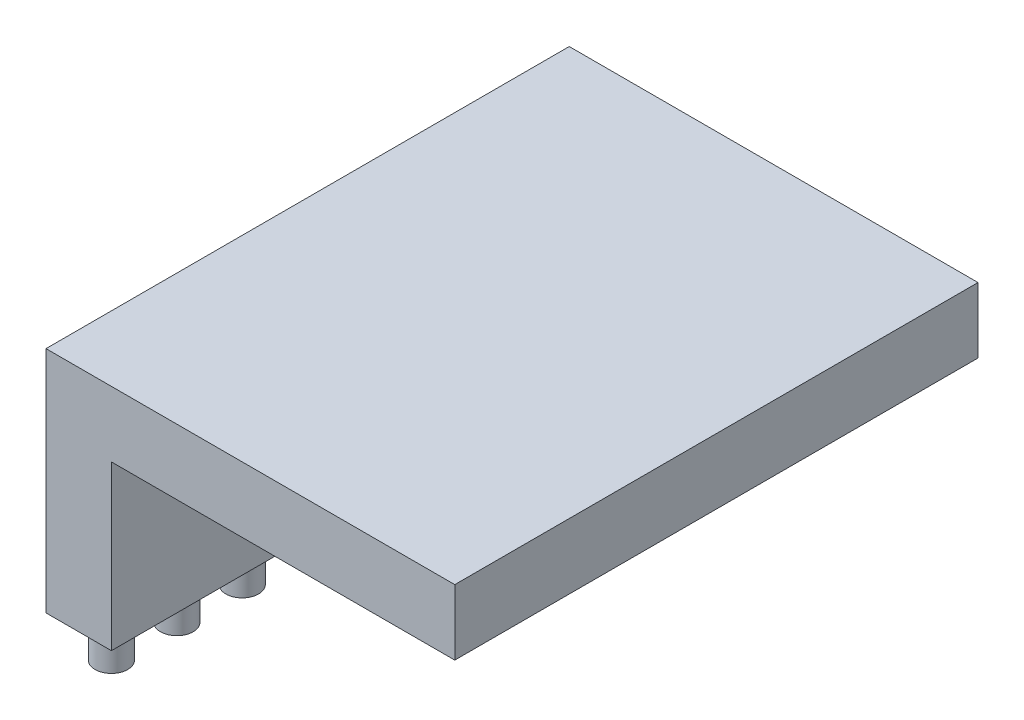
ISO-10303-21;
HEADER;
FILE_DESCRIPTION(('STEP AP214'),'2;1');
FILE_NAME('part.step','',(''),(''),'','','');
FILE_SCHEMA(('AUTOMOTIVE_DESIGN { 1 0 10303 214 1 1 1 1 }'));
ENDSEC;
DATA;
#1=APPLICATION_CONTEXT('core data for automotive mechanical design processes');
#2=APPLICATION_PROTOCOL_DEFINITION('international standard','automotive_design',2000,#1);
#3=PRODUCT_CONTEXT('',#1,'mechanical');
#4=PRODUCT('Part','Part','',(#3));
#5=PRODUCT_RELATED_PRODUCT_CATEGORY('part','',(#4));
#6=PRODUCT_DEFINITION_FORMATION('','',#4);
#7=PRODUCT_DEFINITION_CONTEXT('part definition',#1,'design');
#8=PRODUCT_DEFINITION('design','',#6,#7);
#9=PRODUCT_DEFINITION_SHAPE('','',#8);
#10=(LENGTH_UNIT() NAMED_UNIT(*) SI_UNIT(.MILLI.,.METRE.));
#11=(NAMED_UNIT(*) PLANE_ANGLE_UNIT() SI_UNIT($,.RADIAN.));
#12=(NAMED_UNIT(*) SI_UNIT($,.STERADIAN.) SOLID_ANGLE_UNIT());
#13=UNCERTAINTY_MEASURE_WITH_UNIT(LENGTH_MEASURE(1.E-05),#10,'distance_accuracy_value','');
#14=(GEOMETRIC_REPRESENTATION_CONTEXT(3) GLOBAL_UNCERTAINTY_ASSIGNED_CONTEXT((#13)) GLOBAL_UNIT_ASSIGNED_CONTEXT((#10,
#11,#12)) REPRESENTATION_CONTEXT('',''));
#15=CARTESIAN_POINT('',(0.,0.,0.));
#16=DIRECTION('',(0.,0.,1.));
#17=DIRECTION('',(1.,0.,0.));
#18=AXIS2_PLACEMENT_3D('',#15,#16,#17);
#19=CARTESIAN_POINT('',(0.,0.,0.));
#20=DIRECTION('',(0.,1.,0.));
#21=DIRECTION('',(0.,0.,1.));
#22=AXIS2_PLACEMENT_3D('',#19,#20,#21);
#23=PLANE('',#22);
#24=DIRECTION('',(0.,0.,1.));
#25=VECTOR('',#24,1.);
#26=CARTESIAN_POINT('',(-13.335,0.,0.));
#27=LINE('',#26,#25);
#28=CARTESIAN_POINT('',(-13.335,0.,-20.32));
#29=VERTEX_POINT('',#28);
#30=CARTESIAN_POINT('',(-13.335,0.,0.));
#31=VERTEX_POINT('',#30);
#32=EDGE_CURVE('E48',#29,#31,#27,.T.);
#33=ORIENTED_EDGE('',*,*,#32,.F.);
#34=DIRECTION('',(-1.,0.,0.));
#35=VECTOR('',#34,1.);
#36=CARTESIAN_POINT('',(0.,0.,-20.32));
#37=LINE('',#36,#35);
#38=CARTESIAN_POINT('',(0.,0.,-20.32));
#39=VERTEX_POINT('',#38);
#40=EDGE_CURVE('E135',#39,#29,#37,.T.);
#41=ORIENTED_EDGE('',*,*,#40,.F.);
#42=DIRECTION('',(0.,0.,-1.));
#43=VECTOR('',#42,1.);
#44=CARTESIAN_POINT('',(0.,0.,0.));
#45=LINE('',#44,#43);
#46=CARTESIAN_POINT('',(0.,0.,0.));
#47=VERTEX_POINT('',#46);
#48=EDGE_CURVE('E126',#47,#39,#45,.T.);
#49=ORIENTED_EDGE('',*,*,#48,.F.);
#50=DIRECTION('',(1.,0.,0.));
#51=VECTOR('',#50,1.);
#52=CARTESIAN_POINT('',(0.,0.,0.));
#53=LINE('',#52,#51);
#54=EDGE_CURVE('E70',#31,#47,#53,.T.);
#55=ORIENTED_EDGE('',*,*,#54,.F.);
#56=EDGE_LOOP('',(#33,#41,#49,#55));
#57=FACE_BOUND('',#56,.T.);
#58=ADVANCED_FACE('F33',(#57),#23,.F.);
#59=CARTESIAN_POINT('',(0.,2.54,0.));
#60=DIRECTION('',(-1.,0.,0.));
#61=DIRECTION('',(0.,0.,1.));
#62=AXIS2_PLACEMENT_3D('',#59,#60,#61);
#63=PLANE('',#62);
#64=ORIENTED_EDGE('',*,*,#48,.T.);
#65=DIRECTION('',(0.,-1.,0.));
#66=VECTOR('',#65,1.);
#67=CARTESIAN_POINT('',(0.,2.54,-20.32));
#68=LINE('',#67,#66);
#69=CARTESIAN_POINT('',(0.,2.54,-20.32));
#70=VERTEX_POINT('',#69);
#71=EDGE_CURVE('E11',#70,#39,#68,.T.);
#72=ORIENTED_EDGE('',*,*,#71,.F.);
#73=DIRECTION('',(0.,0.,-1.));
#74=VECTOR('',#73,1.);
#75=CARTESIAN_POINT('',(0.,2.54,0.));
#76=LINE('',#75,#74);
#77=CARTESIAN_POINT('',(0.,2.54,0.));
#78=VERTEX_POINT('',#77);
#79=EDGE_CURVE('E127',#78,#70,#76,.T.);
#80=ORIENTED_EDGE('',*,*,#79,.F.);
#81=DIRECTION('',(0.,-1.,0.));
#82=VECTOR('',#81,1.);
#83=CARTESIAN_POINT('',(0.,2.54,0.));
#84=LINE('',#83,#82);
#85=EDGE_CURVE('E132',#78,#47,#84,.T.);
#86=ORIENTED_EDGE('',*,*,#85,.T.);
#87=EDGE_LOOP('',(#64,#72,#80,#86));
#88=FACE_BOUND('',#87,.T.);
#89=ADVANCED_FACE('F35',(#88),#63,.F.);
#90=CARTESIAN_POINT('',(0.,2.54,-20.32));
#91=DIRECTION('',(0.,0.,1.));
#92=DIRECTION('',(1.,0.,0.));
#93=AXIS2_PLACEMENT_3D('',#90,#91,#92);
#94=PLANE('',#93);
#95=ORIENTED_EDGE('',*,*,#40,.T.);
#96=DIRECTION('',(0.,1.,0.));
#97=VECTOR('',#96,1.);
#98=CARTESIAN_POINT('',(-13.335,-6.35,-20.32));
#99=LINE('',#98,#97);
#100=CARTESIAN_POINT('',(-13.335,-6.35,-20.32));
#101=VERTEX_POINT('',#100);
#102=EDGE_CURVE('E105',#101,#29,#99,.T.);
#103=ORIENTED_EDGE('',*,*,#102,.F.);
#104=DIRECTION('',(1.,0.,0.));
#105=VECTOR('',#104,1.);
#106=CARTESIAN_POINT('',(-15.875,-6.35,-20.32));
#107=LINE('',#106,#105);
#108=CARTESIAN_POINT('',(-15.875,-6.35,-20.32));
#109=VERTEX_POINT('',#108);
#110=EDGE_CURVE('E102',#109,#101,#107,.T.);
#111=ORIENTED_EDGE('',*,*,#110,.F.);
#112=DIRECTION('',(0.,-1.,0.));
#113=VECTOR('',#112,1.);
#114=CARTESIAN_POINT('',(-15.875,2.54,-20.32));
#115=LINE('',#114,#113);
#116=CARTESIAN_POINT('',(-15.875,2.54,-20.32));
#117=VERTEX_POINT('',#116);
#118=EDGE_CURVE('E41',#117,#109,#115,.T.);
#119=ORIENTED_EDGE('',*,*,#118,.F.);
#120=DIRECTION('',(-1.,0.,0.));
#121=VECTOR('',#120,1.);
#122=CARTESIAN_POINT('',(0.,2.54,-20.32));
#123=LINE('',#122,#121);
#124=EDGE_CURVE('E77',#70,#117,#123,.T.);
#125=ORIENTED_EDGE('',*,*,#124,.F.);
#126=ORIENTED_EDGE('',*,*,#71,.T.);
#127=EDGE_LOOP('',(#95,#103,#111,#119,#125,#126));
#128=FACE_BOUND('',#127,.T.);
#129=ADVANCED_FACE('F103',(#128),#94,.F.);
#130=CARTESIAN_POINT('',(-15.875,2.54,0.));
#131=DIRECTION('',(1.,0.,0.));
#132=DIRECTION('',(0.,0.,-1.));
#133=AXIS2_PLACEMENT_3D('',#130,#131,#132);
#134=PLANE('',#133);
#135=ORIENTED_EDGE('',*,*,#118,.T.);
#136=DIRECTION('',(0.,0.,-1.));
#137=VECTOR('',#136,1.);
#138=CARTESIAN_POINT('',(-15.875,-6.35,0.));
#139=LINE('',#138,#137);
#140=CARTESIAN_POINT('',(-15.875,-6.35,0.));
#141=VERTEX_POINT('',#140);
#142=EDGE_CURVE('E98',#141,#109,#139,.T.);
#143=ORIENTED_EDGE('',*,*,#142,.F.);
#144=DIRECTION('',(0.,-1.,0.));
#145=VECTOR('',#144,1.);
#146=CARTESIAN_POINT('',(-15.875,2.54,0.));
#147=LINE('',#146,#145);
#148=CARTESIAN_POINT('',(-15.875,2.54,0.));
#149=VERTEX_POINT('',#148);
#150=EDGE_CURVE('E100',#149,#141,#147,.T.);
#151=ORIENTED_EDGE('',*,*,#150,.F.);
#152=DIRECTION('',(0.,0.,1.));
#153=VECTOR('',#152,1.);
#154=CARTESIAN_POINT('',(-15.875,2.54,0.));
#155=LINE('',#154,#153);
#156=EDGE_CURVE('E99',#117,#149,#155,.T.);
#157=ORIENTED_EDGE('',*,*,#156,.F.);
#158=EDGE_LOOP('',(#135,#143,#151,#157));
#159=FACE_BOUND('',#158,.T.);
#160=ADVANCED_FACE('F95',(#159),#134,.F.);
#161=CARTESIAN_POINT('',(0.,2.54,0.));
#162=DIRECTION('',(0.,0.,-1.));
#163=DIRECTION('',(-1.,0.,0.));
#164=AXIS2_PLACEMENT_3D('',#161,#162,#163);
#165=PLANE('',#164);
#166=ORIENTED_EDGE('',*,*,#150,.T.);
#167=DIRECTION('',(-1.,0.,0.));
#168=VECTOR('',#167,1.);
#169=CARTESIAN_POINT('',(-15.875,-6.35,0.));
#170=LINE('',#169,#168);
#171=CARTESIAN_POINT('',(-13.335,-6.35,0.));
#172=VERTEX_POINT('',#171);
#173=EDGE_CURVE('E113',#172,#141,#170,.T.);
#174=ORIENTED_EDGE('',*,*,#173,.F.);
#175=DIRECTION('',(0.,1.,0.));
#176=VECTOR('',#175,1.);
#177=CARTESIAN_POINT('',(-13.335,-6.35,0.));
#178=LINE('',#177,#176);
#179=EDGE_CURVE('E122',#172,#31,#178,.T.);
#180=ORIENTED_EDGE('',*,*,#179,.T.);
#181=ORIENTED_EDGE('',*,*,#54,.T.);
#182=ORIENTED_EDGE('',*,*,#85,.F.);
#183=DIRECTION('',(1.,0.,0.));
#184=VECTOR('',#183,1.);
#185=CARTESIAN_POINT('',(0.,2.54,0.));
#186=LINE('',#185,#184);
#187=EDGE_CURVE('E57',#149,#78,#186,.T.);
#188=ORIENTED_EDGE('',*,*,#187,.F.);
#189=EDGE_LOOP('',(#166,#174,#180,#181,#182,#188));
#190=FACE_BOUND('',#189,.T.);
#191=ADVANCED_FACE('F139',(#190),#165,.F.);
#192=CARTESIAN_POINT('',(0.,2.54,0.));
#193=DIRECTION('',(0.,1.,0.));
#194=DIRECTION('',(0.,0.,1.));
#195=AXIS2_PLACEMENT_3D('',#192,#193,#194);
#196=PLANE('',#195);
#197=ORIENTED_EDGE('',*,*,#79,.T.);
#198=ORIENTED_EDGE('',*,*,#124,.T.);
#199=ORIENTED_EDGE('',*,*,#156,.T.);
#200=ORIENTED_EDGE('',*,*,#187,.T.);
#201=EDGE_LOOP('',(#197,#198,#199,#200));
#202=FACE_BOUND('',#201,.T.);
#203=ADVANCED_FACE('F144',(#202),#196,.T.);
#204=CARTESIAN_POINT('',(-13.335,-6.35,0.));
#205=DIRECTION('',(-1.,0.,0.));
#206=DIRECTION('',(0.,0.,1.));
#207=AXIS2_PLACEMENT_3D('',#204,#205,#206);
#208=PLANE('',#207);
#209=ORIENTED_EDGE('',*,*,#32,.T.);
#210=ORIENTED_EDGE('',*,*,#179,.F.);
#211=DIRECTION('',(0.,0.,1.));
#212=VECTOR('',#211,1.);
#213=CARTESIAN_POINT('',(-13.335,-6.35,0.));
#214=LINE('',#213,#212);
#215=EDGE_CURVE('E108',#101,#172,#214,.T.);
#216=ORIENTED_EDGE('',*,*,#215,.F.);
#217=ORIENTED_EDGE('',*,*,#102,.T.);
#218=EDGE_LOOP('',(#209,#210,#216,#217));
#219=FACE_BOUND('',#218,.T.);
#220=ADVANCED_FACE('F146',(#219),#208,.F.);
#221=CARTESIAN_POINT('',(0.,-6.35,0.));
#222=DIRECTION('',(0.,-1.,0.));
#223=DIRECTION('',(0.,0.,-1.));
#224=AXIS2_PLACEMENT_3D('',#221,#222,#223);
#225=PLANE('',#224);
#226=CARTESIAN_POINT('',(-14.6049999999998,-6.35,-19.05));
#227=DIRECTION('',(0.,-1.,0.));
#228=DIRECTION('',(0.,0.,-1.));
#229=AXIS2_PLACEMENT_3D('',#226,#227,#228);
#230=CIRCLE('',#229,0.634999999999999);
#231=CARTESIAN_POINT('',(-14.6049999999998,-6.35,-19.685));
#232=VERTEX_POINT('',#231);
#233=EDGE_CURVE('E359',#232,#232,#230,.T.);
#234=ORIENTED_EDGE('',*,*,#233,.F.);
#235=EDGE_LOOP('',(#234));
#236=FACE_BOUND('',#235,.T.);
#237=CARTESIAN_POINT('',(-14.6049999999998,-6.35,-16.51));
#238=DIRECTION('',(0.,-1.,0.));
#239=DIRECTION('',(0.,0.,-1.));
#240=AXIS2_PLACEMENT_3D('',#237,#238,#239);
#241=CIRCLE('',#240,0.634999999999999);
#242=CARTESIAN_POINT('',(-14.6049999999998,-6.35,-17.145));
#243=VERTEX_POINT('',#242);
#244=EDGE_CURVE('E358',#243,#243,#241,.T.);
#245=ORIENTED_EDGE('',*,*,#244,.F.);
#246=EDGE_LOOP('',(#245));
#247=FACE_BOUND('',#246,.T.);
#248=CARTESIAN_POINT('',(-14.6049999999999,-6.35,-13.97));
#249=DIRECTION('',(0.,-1.,0.));
#250=DIRECTION('',(0.,0.,-1.));
#251=AXIS2_PLACEMENT_3D('',#248,#249,#250);
#252=CIRCLE('',#251,0.634999999999999);
#253=CARTESIAN_POINT('',(-14.6049999999999,-6.35,-14.605));
#254=VERTEX_POINT('',#253);
#255=EDGE_CURVE('E368',#254,#254,#252,.T.);
#256=ORIENTED_EDGE('',*,*,#255,.F.);
#257=EDGE_LOOP('',(#256));
#258=FACE_BOUND('',#257,.T.);
#259=CARTESIAN_POINT('',(-14.6049999999999,-6.35,-11.43));
#260=DIRECTION('',(0.,-1.,0.));
#261=DIRECTION('',(0.,0.,-1.));
#262=AXIS2_PLACEMENT_3D('',#259,#260,#261);
#263=CIRCLE('',#262,0.634999999999999);
#264=CARTESIAN_POINT('',(-14.6049999999999,-6.35,-12.065));
#265=VERTEX_POINT('',#264);
#266=EDGE_CURVE('E373',#265,#265,#263,.T.);
#267=ORIENTED_EDGE('',*,*,#266,.F.);
#268=EDGE_LOOP('',(#267));
#269=FACE_BOUND('',#268,.T.);
#270=CARTESIAN_POINT('',(-14.6049999999999,-6.35,-8.89));
#271=DIRECTION('',(0.,-1.,0.));
#272=DIRECTION('',(0.,0.,-1.));
#273=AXIS2_PLACEMENT_3D('',#270,#271,#272);
#274=CIRCLE('',#273,0.634999999999999);
#275=CARTESIAN_POINT('',(-14.6049999999999,-6.35,-9.525));
#276=VERTEX_POINT('',#275);
#277=EDGE_CURVE('E379',#276,#276,#274,.T.);
#278=ORIENTED_EDGE('',*,*,#277,.F.);
#279=EDGE_LOOP('',(#278));
#280=FACE_BOUND('',#279,.T.);
#281=CARTESIAN_POINT('',(-14.6049999999999,-6.35,-6.35));
#282=DIRECTION('',(0.,-1.,0.));
#283=DIRECTION('',(0.,0.,-1.));
#284=AXIS2_PLACEMENT_3D('',#281,#282,#283);
#285=CIRCLE('',#284,0.634999999999999);
#286=CARTESIAN_POINT('',(-14.6049999999999,-6.35,-6.985));
#287=VERTEX_POINT('',#286);
#288=EDGE_CURVE('E385',#287,#287,#285,.T.);
#289=ORIENTED_EDGE('',*,*,#288,.F.);
#290=EDGE_LOOP('',(#289));
#291=FACE_BOUND('',#290,.T.);
#292=CARTESIAN_POINT('',(-14.605,-6.35,-3.81));
#293=DIRECTION('',(0.,-1.,0.));
#294=DIRECTION('',(0.,0.,-1.));
#295=AXIS2_PLACEMENT_3D('',#292,#293,#294);
#296=CIRCLE('',#295,0.634999999999999);
#297=CARTESIAN_POINT('',(-14.605,-6.35,-4.445));
#298=VERTEX_POINT('',#297);
#299=EDGE_CURVE('E391',#298,#298,#296,.T.);
#300=ORIENTED_EDGE('',*,*,#299,.F.);
#301=EDGE_LOOP('',(#300));
#302=FACE_BOUND('',#301,.T.);
#303=CARTESIAN_POINT('',(-14.605,-6.35,-1.27));
#304=DIRECTION('',(0.,-1.,0.));
#305=DIRECTION('',(0.,0.,-1.));
#306=AXIS2_PLACEMENT_3D('',#303,#304,#305);
#307=CIRCLE('',#306,0.634999999999999);
#308=CARTESIAN_POINT('',(-14.605,-6.35,-1.905));
#309=VERTEX_POINT('',#308);
#310=EDGE_CURVE('E118',#309,#309,#307,.T.);
#311=ORIENTED_EDGE('',*,*,#310,.F.);
#312=EDGE_LOOP('',(#311));
#313=FACE_BOUND('',#312,.T.);
#314=ORIENTED_EDGE('',*,*,#142,.T.);
#315=ORIENTED_EDGE('',*,*,#110,.T.);
#316=ORIENTED_EDGE('',*,*,#215,.T.);
#317=ORIENTED_EDGE('',*,*,#173,.T.);
#318=EDGE_LOOP('',(#314,#315,#316,#317));
#319=FACE_BOUND('',#318,.T.);
#320=ADVANCED_FACE('F111',(#236,#247,#258,#269,#280,#291,#302,#313,#319),#225,.T.);
#321=CARTESIAN_POINT('',(-14.605,-7.9375,-1.27));
#322=DIRECTION('',(0.,1.,0.));
#323=DIRECTION('',(0.,0.,1.));
#324=AXIS2_PLACEMENT_3D('',#321,#322,#323);
#325=CYLINDRICAL_SURFACE('',#324,0.634999999999999);
#326=CARTESIAN_POINT('',(-14.605,-7.9375,-1.27));
#327=DIRECTION('',(0.,-1.,0.));
#328=DIRECTION('',(0.,0.,-1.));
#329=AXIS2_PLACEMENT_3D('',#326,#327,#328);
#330=CIRCLE('',#329,0.634999999999999);
#331=CARTESIAN_POINT('',(-14.605,-7.9375,-1.905));
#332=VERTEX_POINT('',#331);
#333=EDGE_CURVE('E115',#332,#332,#330,.T.);
#334=ORIENTED_EDGE('',*,*,#333,.F.);
#335=EDGE_LOOP('',(#334));
#336=FACE_BOUND('',#335,.T.);
#337=ORIENTED_EDGE('',*,*,#310,.T.);
#338=EDGE_LOOP('',(#337));
#339=FACE_BOUND('',#338,.T.);
#340=ADVANCED_FACE('F191',(#336,#339),#325,.T.);
#341=CARTESIAN_POINT('',(-14.605,-7.9375,-1.27));
#342=DIRECTION('',(0.,-1.,0.));
#343=DIRECTION('',(0.,0.,-1.));
#344=AXIS2_PLACEMENT_3D('',#341,#342,#343);
#345=PLANE('',#344);
#346=ORIENTED_EDGE('',*,*,#333,.T.);
#347=EDGE_LOOP('',(#346));
#348=FACE_BOUND('',#347,.T.);
#349=ADVANCED_FACE('F201',(#348),#345,.T.);
#350=CARTESIAN_POINT('',(-14.605,-7.9375,-3.81));
#351=DIRECTION('',(0.,1.,0.));
#352=DIRECTION('',(0.,0.,1.));
#353=AXIS2_PLACEMENT_3D('',#350,#351,#352);
#354=CYLINDRICAL_SURFACE('',#353,0.634999999999999);
#355=CARTESIAN_POINT('',(-14.605,-7.9375,-3.81));
#356=DIRECTION('',(0.,-1.,0.));
#357=DIRECTION('',(0.,0.,-1.));
#358=AXIS2_PLACEMENT_3D('',#355,#356,#357);
#359=CIRCLE('',#358,0.634999999999999);
#360=CARTESIAN_POINT('',(-14.605,-7.9375,-4.445));
#361=VERTEX_POINT('',#360);
#362=EDGE_CURVE('E394',#361,#361,#359,.T.);
#363=ORIENTED_EDGE('',*,*,#362,.F.);
#364=EDGE_LOOP('',(#363));
#365=FACE_BOUND('',#364,.T.);
#366=ORIENTED_EDGE('',*,*,#299,.T.);
#367=EDGE_LOOP('',(#366));
#368=FACE_BOUND('',#367,.T.);
#369=ADVANCED_FACE('F211',(#365,#368),#354,.T.);
#370=CARTESIAN_POINT('',(-14.605,-7.9375,-3.81));
#371=DIRECTION('',(0.,-1.,0.));
#372=DIRECTION('',(0.,0.,-1.));
#373=AXIS2_PLACEMENT_3D('',#370,#371,#372);
#374=PLANE('',#373);
#375=ORIENTED_EDGE('',*,*,#362,.T.);
#376=EDGE_LOOP('',(#375));
#377=FACE_BOUND('',#376,.T.);
#378=ADVANCED_FACE('F221',(#377),#374,.T.);
#379=CARTESIAN_POINT('',(-14.6049999999999,-7.9375,-6.35));
#380=DIRECTION('',(0.,1.,0.));
#381=DIRECTION('',(0.,0.,1.));
#382=AXIS2_PLACEMENT_3D('',#379,#380,#381);
#383=CYLINDRICAL_SURFACE('',#382,0.634999999999999);
#384=CARTESIAN_POINT('',(-14.6049999999999,-7.9375,-6.35));
#385=DIRECTION('',(0.,-1.,0.));
#386=DIRECTION('',(0.,0.,-1.));
#387=AXIS2_PLACEMENT_3D('',#384,#385,#386);
#388=CIRCLE('',#387,0.634999999999999);
#389=CARTESIAN_POINT('',(-14.6049999999999,-7.9375,-6.985));
#390=VERTEX_POINT('',#389);
#391=EDGE_CURVE('E388',#390,#390,#388,.T.);
#392=ORIENTED_EDGE('',*,*,#391,.F.);
#393=EDGE_LOOP('',(#392));
#394=FACE_BOUND('',#393,.T.);
#395=ORIENTED_EDGE('',*,*,#288,.T.);
#396=EDGE_LOOP('',(#395));
#397=FACE_BOUND('',#396,.T.);
#398=ADVANCED_FACE('F231',(#394,#397),#383,.T.);
#399=CARTESIAN_POINT('',(-14.6049999999999,-7.9375,-6.35));
#400=DIRECTION('',(0.,-1.,0.));
#401=DIRECTION('',(0.,0.,-1.));
#402=AXIS2_PLACEMENT_3D('',#399,#400,#401);
#403=PLANE('',#402);
#404=ORIENTED_EDGE('',*,*,#391,.T.);
#405=EDGE_LOOP('',(#404));
#406=FACE_BOUND('',#405,.T.);
#407=ADVANCED_FACE('F241',(#406),#403,.T.);
#408=CARTESIAN_POINT('',(-14.6049999999999,-7.9375,-8.89));
#409=DIRECTION('',(0.,1.,0.));
#410=DIRECTION('',(0.,0.,1.));
#411=AXIS2_PLACEMENT_3D('',#408,#409,#410);
#412=CYLINDRICAL_SURFACE('',#411,0.634999999999999);
#413=CARTESIAN_POINT('',(-14.6049999999999,-7.9375,-8.89));
#414=DIRECTION('',(0.,-1.,0.));
#415=DIRECTION('',(0.,0.,-1.));
#416=AXIS2_PLACEMENT_3D('',#413,#414,#415);
#417=CIRCLE('',#416,0.634999999999999);
#418=CARTESIAN_POINT('',(-14.6049999999999,-7.9375,-9.525));
#419=VERTEX_POINT('',#418);
#420=EDGE_CURVE('E382',#419,#419,#417,.T.);
#421=ORIENTED_EDGE('',*,*,#420,.F.);
#422=EDGE_LOOP('',(#421));
#423=FACE_BOUND('',#422,.T.);
#424=ORIENTED_EDGE('',*,*,#277,.T.);
#425=EDGE_LOOP('',(#424));
#426=FACE_BOUND('',#425,.T.);
#427=ADVANCED_FACE('F251',(#423,#426),#412,.T.);
#428=CARTESIAN_POINT('',(-14.6049999999999,-7.9375,-8.89));
#429=DIRECTION('',(0.,-1.,0.));
#430=DIRECTION('',(0.,0.,-1.));
#431=AXIS2_PLACEMENT_3D('',#428,#429,#430);
#432=PLANE('',#431);
#433=ORIENTED_EDGE('',*,*,#420,.T.);
#434=EDGE_LOOP('',(#433));
#435=FACE_BOUND('',#434,.T.);
#436=ADVANCED_FACE('F261',(#435),#432,.T.);
#437=CARTESIAN_POINT('',(-14.6049999999999,-7.9375,-11.43));
#438=DIRECTION('',(0.,1.,0.));
#439=DIRECTION('',(0.,0.,1.));
#440=AXIS2_PLACEMENT_3D('',#437,#438,#439);
#441=CYLINDRICAL_SURFACE('',#440,0.634999999999999);
#442=CARTESIAN_POINT('',(-14.6049999999999,-7.9375,-11.43));
#443=DIRECTION('',(0.,-1.,0.));
#444=DIRECTION('',(0.,0.,-1.));
#445=AXIS2_PLACEMENT_3D('',#442,#443,#444);
#446=CIRCLE('',#445,0.634999999999999);
#447=CARTESIAN_POINT('',(-14.6049999999999,-7.9375,-12.065));
#448=VERTEX_POINT('',#447);
#449=EDGE_CURVE('E376',#448,#448,#446,.T.);
#450=ORIENTED_EDGE('',*,*,#449,.F.);
#451=EDGE_LOOP('',(#450));
#452=FACE_BOUND('',#451,.T.);
#453=ORIENTED_EDGE('',*,*,#266,.T.);
#454=EDGE_LOOP('',(#453));
#455=FACE_BOUND('',#454,.T.);
#456=ADVANCED_FACE('F271',(#452,#455),#441,.T.);
#457=CARTESIAN_POINT('',(-14.6049999999999,-7.9375,-11.43));
#458=DIRECTION('',(0.,-1.,0.));
#459=DIRECTION('',(0.,0.,-1.));
#460=AXIS2_PLACEMENT_3D('',#457,#458,#459);
#461=PLANE('',#460);
#462=ORIENTED_EDGE('',*,*,#449,.T.);
#463=EDGE_LOOP('',(#462));
#464=FACE_BOUND('',#463,.T.);
#465=ADVANCED_FACE('F281',(#464),#461,.T.);
#466=CARTESIAN_POINT('',(-14.6049999999999,-7.9375,-13.97));
#467=DIRECTION('',(0.,1.,0.));
#468=DIRECTION('',(0.,0.,1.));
#469=AXIS2_PLACEMENT_3D('',#466,#467,#468);
#470=CYLINDRICAL_SURFACE('',#469,0.634999999999999);
#471=CARTESIAN_POINT('',(-14.6049999999999,-7.9375,-13.97));
#472=DIRECTION('',(0.,-1.,0.));
#473=DIRECTION('',(0.,0.,-1.));
#474=AXIS2_PLACEMENT_3D('',#471,#472,#473);
#475=CIRCLE('',#474,0.634999999999999);
#476=CARTESIAN_POINT('',(-14.6049999999999,-7.9375,-14.605));
#477=VERTEX_POINT('',#476);
#478=EDGE_CURVE('E370',#477,#477,#475,.T.);
#479=ORIENTED_EDGE('',*,*,#478,.F.);
#480=EDGE_LOOP('',(#479));
#481=FACE_BOUND('',#480,.T.);
#482=ORIENTED_EDGE('',*,*,#255,.T.);
#483=EDGE_LOOP('',(#482));
#484=FACE_BOUND('',#483,.T.);
#485=ADVANCED_FACE('F291',(#481,#484),#470,.T.);
#486=CARTESIAN_POINT('',(-14.6049999999999,-7.9375,-13.97));
#487=DIRECTION('',(0.,-1.,0.));
#488=DIRECTION('',(0.,0.,-1.));
#489=AXIS2_PLACEMENT_3D('',#486,#487,#488);
#490=PLANE('',#489);
#491=ORIENTED_EDGE('',*,*,#478,.T.);
#492=EDGE_LOOP('',(#491));
#493=FACE_BOUND('',#492,.T.);
#494=ADVANCED_FACE('F301',(#493),#490,.T.);
#495=CARTESIAN_POINT('',(-14.6049999999998,-7.9375,-16.51));
#496=DIRECTION('',(0.,1.,0.));
#497=DIRECTION('',(0.,0.,1.));
#498=AXIS2_PLACEMENT_3D('',#495,#496,#497);
#499=CYLINDRICAL_SURFACE('',#498,0.634999999999999);
#500=CARTESIAN_POINT('',(-14.6049999999998,-7.9375,-16.51));
#501=DIRECTION('',(0.,-1.,0.));
#502=DIRECTION('',(0.,0.,-1.));
#503=AXIS2_PLACEMENT_3D('',#500,#501,#502);
#504=CIRCLE('',#503,0.634999999999999);
#505=CARTESIAN_POINT('',(-14.6049999999998,-7.9375,-17.145));
#506=VERTEX_POINT('',#505);
#507=EDGE_CURVE('E362',#506,#506,#504,.T.);
#508=ORIENTED_EDGE('',*,*,#507,.F.);
#509=EDGE_LOOP('',(#508));
#510=FACE_BOUND('',#509,.T.);
#511=ORIENTED_EDGE('',*,*,#244,.T.);
#512=EDGE_LOOP('',(#511));
#513=FACE_BOUND('',#512,.T.);
#514=ADVANCED_FACE('F311',(#510,#513),#499,.T.);
#515=CARTESIAN_POINT('',(-14.6049999999998,-7.9375,-16.51));
#516=DIRECTION('',(0.,-1.,0.));
#517=DIRECTION('',(0.,0.,-1.));
#518=AXIS2_PLACEMENT_3D('',#515,#516,#517);
#519=PLANE('',#518);
#520=ORIENTED_EDGE('',*,*,#507,.T.);
#521=EDGE_LOOP('',(#520));
#522=FACE_BOUND('',#521,.T.);
#523=ADVANCED_FACE('F321',(#522),#519,.T.);
#524=CARTESIAN_POINT('',(-14.6049999999998,-7.9375,-19.05));
#525=DIRECTION('',(0.,1.,0.));
#526=DIRECTION('',(0.,0.,1.));
#527=AXIS2_PLACEMENT_3D('',#524,#525,#526);
#528=CYLINDRICAL_SURFACE('',#527,0.634999999999999);
#529=CARTESIAN_POINT('',(-14.6049999999998,-7.9375,-19.05));
#530=DIRECTION('',(0.,-1.,0.));
#531=DIRECTION('',(0.,0.,-1.));
#532=AXIS2_PLACEMENT_3D('',#529,#530,#531);
#533=CIRCLE('',#532,0.634999999999999);
#534=CARTESIAN_POINT('',(-14.6049999999998,-7.9375,-19.685));
#535=VERTEX_POINT('',#534);
#536=EDGE_CURVE('E357',#535,#535,#533,.T.);
#537=ORIENTED_EDGE('',*,*,#536,.F.);
#538=EDGE_LOOP('',(#537));
#539=FACE_BOUND('',#538,.T.);
#540=ORIENTED_EDGE('',*,*,#233,.T.);
#541=EDGE_LOOP('',(#540));
#542=FACE_BOUND('',#541,.T.);
#543=ADVANCED_FACE('F331',(#539,#542),#528,.T.);
#544=CARTESIAN_POINT('',(-14.6049999999998,-7.9375,-19.05));
#545=DIRECTION('',(0.,-1.,0.));
#546=DIRECTION('',(0.,0.,-1.));
#547=AXIS2_PLACEMENT_3D('',#544,#545,#546);
#548=PLANE('',#547);
#549=ORIENTED_EDGE('',*,*,#536,.T.);
#550=EDGE_LOOP('',(#549));
#551=FACE_BOUND('',#550,.T.);
#552=ADVANCED_FACE('F341',(#551),#548,.T.);
#553=CLOSED_SHELL('',(#58,#89,#129,#160,#191,#203,#220,#320,#340,#349,#369,#378,#398,#407,#427,
#436,#456,#465,#485,#494,#514,#523,#543,#552));
#554=MANIFOLD_SOLID_BREP('B2',#553);
#555=ADVANCED_BREP_SHAPE_REPRESENTATION('',(#18,#554),#14);
#556=SHAPE_DEFINITION_REPRESENTATION(#9,#555);
ENDSEC;
END-ISO-10303-21;
